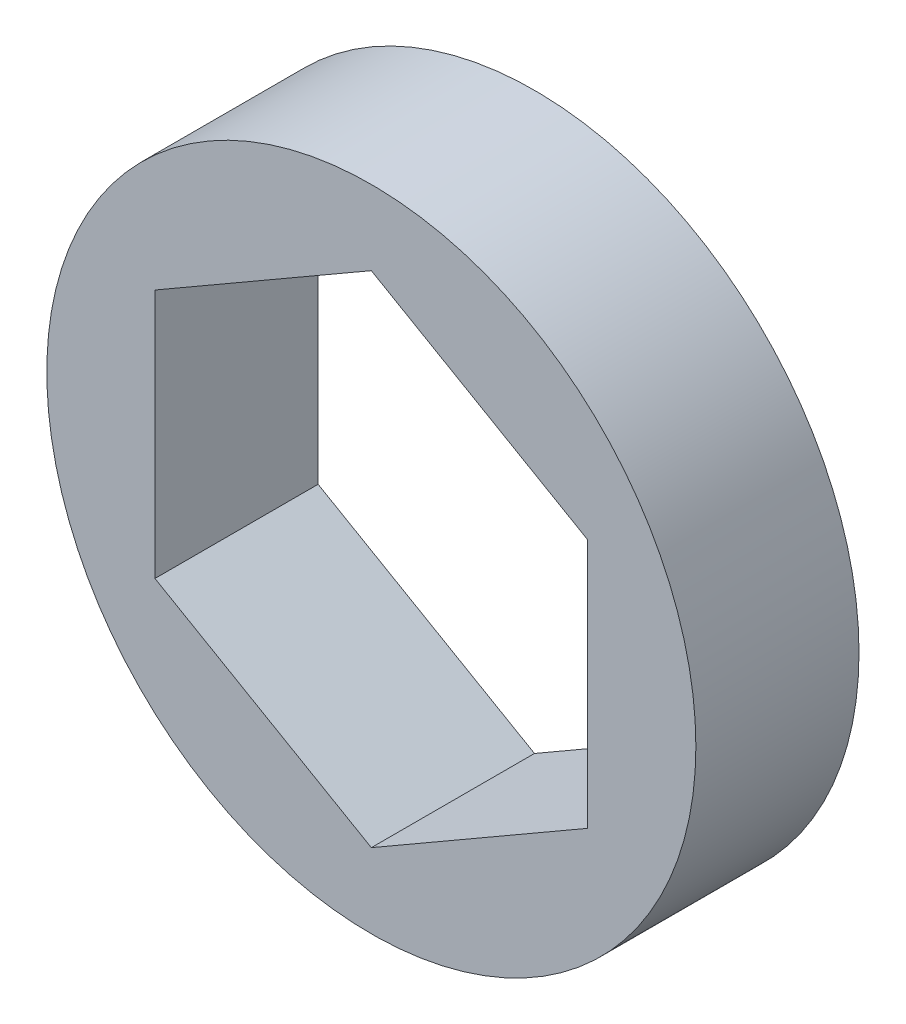
ISO-10303-21;
HEADER;
FILE_DESCRIPTION(('STEP AP214'),'2;1');
FILE_NAME('part.step','',(''),(''),'','','');
FILE_SCHEMA(('AUTOMOTIVE_DESIGN { 1 0 10303 214 1 1 1 1 }'));
ENDSEC;
DATA;
#1=APPLICATION_CONTEXT('core data for automotive mechanical design processes');
#2=APPLICATION_PROTOCOL_DEFINITION('international standard','automotive_design',2000,#1);
#3=PRODUCT_CONTEXT('',#1,'mechanical');
#4=PRODUCT('Part','Part','',(#3));
#5=PRODUCT_RELATED_PRODUCT_CATEGORY('part','',(#4));
#6=PRODUCT_DEFINITION_FORMATION('','',#4);
#7=PRODUCT_DEFINITION_CONTEXT('part definition',#1,'design');
#8=PRODUCT_DEFINITION('design','',#6,#7);
#9=PRODUCT_DEFINITION_SHAPE('','',#8);
#10=(LENGTH_UNIT() NAMED_UNIT(*) SI_UNIT(.MILLI.,.METRE.));
#11=(NAMED_UNIT(*) PLANE_ANGLE_UNIT() SI_UNIT($,.RADIAN.));
#12=(NAMED_UNIT(*) SI_UNIT($,.STERADIAN.) SOLID_ANGLE_UNIT());
#13=UNCERTAINTY_MEASURE_WITH_UNIT(LENGTH_MEASURE(1.E-05),#10,'distance_accuracy_value','');
#14=(GEOMETRIC_REPRESENTATION_CONTEXT(3) GLOBAL_UNCERTAINTY_ASSIGNED_CONTEXT((#13)) GLOBAL_UNIT_ASSIGNED_CONTEXT((#10,
#11,#12)) REPRESENTATION_CONTEXT('',''));
#15=CARTESIAN_POINT('',(0.,0.,0.));
#16=DIRECTION('',(0.,0.,1.));
#17=DIRECTION('',(1.,0.,0.));
#18=AXIS2_PLACEMENT_3D('',#15,#16,#17);
#19=CARTESIAN_POINT('',(0.,0.,4.7879));
#20=DIRECTION('',(0.,0.,1.));
#21=DIRECTION('',(1.,0.,0.));
#22=AXIS2_PLACEMENT_3D('',#19,#20,#21);
#23=PLANE('',#22);
#24=CARTESIAN_POINT('',(0.,0.,4.7879));
#25=DIRECTION('',(0.,0.,1.));
#26=DIRECTION('',(1.,0.,0.));
#27=AXIS2_PLACEMENT_3D('',#24,#25,#26);
#28=CIRCLE('',#27,9.525);
#29=CARTESIAN_POINT('',(9.525,0.,4.7879));
#30=VERTEX_POINT('',#29);
#31=EDGE_CURVE('E11',#30,#30,#28,.T.);
#32=ORIENTED_EDGE('',*,*,#31,.T.);
#33=EDGE_LOOP('',(#32));
#34=FACE_BOUND('',#33,.T.);
#35=DIRECTION('',(-0.866025403784438,-0.500000000000001,0.));
#36=VECTOR('',#35,1.);
#37=CARTESIAN_POINT('',(0.,7.33234841870825,4.7879));
#38=LINE('',#37,#36);
#39=CARTESIAN_POINT('',(0.,7.33234841870825,4.7879));
#40=VERTEX_POINT('',#39);
#41=CARTESIAN_POINT('',(-6.35000000000001,3.66617420935411,4.7879));
#42=VERTEX_POINT('',#41);
#43=EDGE_CURVE('E106',#40,#42,#38,.T.);
#44=ORIENTED_EDGE('',*,*,#43,.F.);
#45=DIRECTION('',(-0.866025403784441,0.499999999999995,0.));
#46=VECTOR('',#45,1.);
#47=CARTESIAN_POINT('',(6.34999999999996,3.6661742093542,4.7879));
#48=LINE('',#47,#46);
#49=CARTESIAN_POINT('',(6.34999999999996,3.6661742093542,4.7879));
#50=VERTEX_POINT('',#49);
#51=EDGE_CURVE('E97',#50,#40,#48,.T.);
#52=ORIENTED_EDGE('',*,*,#51,.F.);
#53=DIRECTION('',(0.,1.,0.));
#54=VECTOR('',#53,1.);
#55=CARTESIAN_POINT('',(6.35000000000003,-3.66617420935406,4.7879));
#56=LINE('',#55,#54);
#57=CARTESIAN_POINT('',(6.35000000000003,-3.66617420935406,4.7879));
#58=VERTEX_POINT('',#57);
#59=EDGE_CURVE('E131',#58,#50,#56,.T.);
#60=ORIENTED_EDGE('',*,*,#59,.F.);
#61=DIRECTION('',(0.866025403784434,0.500000000000007,0.));
#62=VECTOR('',#61,1.);
#63=CARTESIAN_POINT('',(0.,-7.33234841870825,4.7879));
#64=LINE('',#63,#62);
#65=CARTESIAN_POINT('',(0.,-7.33234841870825,4.7879));
#66=VERTEX_POINT('',#65);
#67=EDGE_CURVE('E128',#66,#58,#64,.T.);
#68=ORIENTED_EDGE('',*,*,#67,.F.);
#69=DIRECTION('',(0.866025403784442,-0.499999999999995,0.));
#70=VECTOR('',#69,1.);
#71=CARTESIAN_POINT('',(-6.34999999999998,-3.66617420935415,4.7879));
#72=LINE('',#71,#70);
#73=CARTESIAN_POINT('',(-6.34999999999998,-3.66617420935415,4.7879));
#74=VERTEX_POINT('',#73);
#75=EDGE_CURVE('E123',#74,#66,#72,.T.);
#76=ORIENTED_EDGE('',*,*,#75,.F.);
#77=DIRECTION('',(0.,-1.,0.));
#78=VECTOR('',#77,1.);
#79=CARTESIAN_POINT('',(-6.35000000000001,3.66617420935411,4.7879));
#80=LINE('',#79,#78);
#81=EDGE_CURVE('E119',#42,#74,#80,.T.);
#82=ORIENTED_EDGE('',*,*,#81,.F.);
#83=EDGE_LOOP('',(#44,#52,#60,#68,#76,#82));
#84=FACE_BOUND('',#83,.T.);
#85=ADVANCED_FACE('F43',(#34,#84),#23,.T.);
#86=CARTESIAN_POINT('',(0.,0.,0.));
#87=DIRECTION('',(0.,0.,1.));
#88=DIRECTION('',(1.,0.,0.));
#89=AXIS2_PLACEMENT_3D('',#86,#87,#88);
#90=PLANE('',#89);
#91=CARTESIAN_POINT('',(0.,0.,0.));
#92=DIRECTION('',(0.,0.,1.));
#93=DIRECTION('',(1.,0.,0.));
#94=AXIS2_PLACEMENT_3D('',#91,#92,#93);
#95=CIRCLE('',#94,9.525);
#96=CARTESIAN_POINT('',(9.525,0.,0.));
#97=VERTEX_POINT('',#96);
#98=EDGE_CURVE('E47',#97,#97,#95,.T.);
#99=ORIENTED_EDGE('',*,*,#98,.F.);
#100=EDGE_LOOP('',(#99));
#101=FACE_BOUND('',#100,.T.);
#102=DIRECTION('',(-0.866025403784441,0.499999999999995,0.));
#103=VECTOR('',#102,1.);
#104=CARTESIAN_POINT('',(6.34999999999996,3.6661742093542,0.));
#105=LINE('',#104,#103);
#106=CARTESIAN_POINT('',(6.34999999999996,3.6661742093542,0.));
#107=VERTEX_POINT('',#106);
#108=CARTESIAN_POINT('',(0.,7.33234841870825,0.));
#109=VERTEX_POINT('',#108);
#110=EDGE_CURVE('E67',#107,#109,#105,.T.);
#111=ORIENTED_EDGE('',*,*,#110,.T.);
#112=DIRECTION('',(-0.866025403784438,-0.500000000000001,0.));
#113=VECTOR('',#112,1.);
#114=CARTESIAN_POINT('',(0.,7.33234841870825,0.));
#115=LINE('',#114,#113);
#116=CARTESIAN_POINT('',(-6.35000000000001,3.66617420935411,0.));
#117=VERTEX_POINT('',#116);
#118=EDGE_CURVE('E113',#109,#117,#115,.T.);
#119=ORIENTED_EDGE('',*,*,#118,.T.);
#120=DIRECTION('',(0.,-1.,0.));
#121=VECTOR('',#120,1.);
#122=CARTESIAN_POINT('',(-6.35000000000001,3.66617420935411,0.));
#123=LINE('',#122,#121);
#124=CARTESIAN_POINT('',(-6.34999999999998,-3.66617420935415,0.));
#125=VERTEX_POINT('',#124);
#126=EDGE_CURVE('E138',#117,#125,#123,.T.);
#127=ORIENTED_EDGE('',*,*,#126,.T.);
#128=DIRECTION('',(0.866025403784442,-0.499999999999995,0.));
#129=VECTOR('',#128,1.);
#130=CARTESIAN_POINT('',(-6.34999999999998,-3.66617420935415,0.));
#131=LINE('',#130,#129);
#132=CARTESIAN_POINT('',(0.,-7.33234841870825,0.));
#133=VERTEX_POINT('',#132);
#134=EDGE_CURVE('E142',#125,#133,#131,.T.);
#135=ORIENTED_EDGE('',*,*,#134,.T.);
#136=DIRECTION('',(0.866025403784434,0.500000000000007,0.));
#137=VECTOR('',#136,1.);
#138=CARTESIAN_POINT('',(0.,-7.33234841870825,0.));
#139=LINE('',#138,#137);
#140=CARTESIAN_POINT('',(6.35000000000003,-3.66617420935406,0.));
#141=VERTEX_POINT('',#140);
#142=EDGE_CURVE('E146',#133,#141,#139,.T.);
#143=ORIENTED_EDGE('',*,*,#142,.T.);
#144=DIRECTION('',(0.,1.,0.));
#145=VECTOR('',#144,1.);
#146=CARTESIAN_POINT('',(6.35000000000003,-3.66617420935406,0.));
#147=LINE('',#146,#145);
#148=EDGE_CURVE('E107',#141,#107,#147,.T.);
#149=ORIENTED_EDGE('',*,*,#148,.T.);
#150=EDGE_LOOP('',(#111,#119,#127,#135,#143,#149));
#151=FACE_BOUND('',#150,.T.);
#152=ADVANCED_FACE('F170',(#101,#151),#90,.F.);
#153=CARTESIAN_POINT('',(0.,0.,4.7879));
#154=DIRECTION('',(0.,0.,-1.));
#155=DIRECTION('',(-1.,0.,0.));
#156=AXIS2_PLACEMENT_3D('',#153,#154,#155);
#157=CYLINDRICAL_SURFACE('',#156,9.525);
#158=ORIENTED_EDGE('',*,*,#31,.F.);
#159=EDGE_LOOP('',(#158));
#160=FACE_BOUND('',#159,.T.);
#161=ORIENTED_EDGE('',*,*,#98,.T.);
#162=EDGE_LOOP('',(#161));
#163=FACE_BOUND('',#162,.T.);
#164=ADVANCED_FACE('F45',(#160,#163),#157,.T.);
#165=CARTESIAN_POINT('',(6.34999999999996,3.6661742093542,4.7879));
#166=DIRECTION('',(-0.499999999999995,-0.866025403784441,0.));
#167=DIRECTION('',(0.866025403784442,-0.499999999999995,0.));
#168=AXIS2_PLACEMENT_3D('',#165,#166,#167);
#169=PLANE('',#168);
#170=ORIENTED_EDGE('',*,*,#110,.F.);
#171=DIRECTION('',(0.,0.,-1.));
#172=VECTOR('',#171,1.);
#173=CARTESIAN_POINT('',(6.34999999999996,3.6661742093542,4.7879));
#174=LINE('',#173,#172);
#175=EDGE_CURVE('E101',#50,#107,#174,.T.);
#176=ORIENTED_EDGE('',*,*,#175,.F.);
#177=ORIENTED_EDGE('',*,*,#51,.T.);
#178=DIRECTION('',(0.,0.,-1.));
#179=VECTOR('',#178,1.);
#180=CARTESIAN_POINT('',(0.,7.33234841870825,4.7879));
#181=LINE('',#180,#179);
#182=EDGE_CURVE('E100',#40,#109,#181,.T.);
#183=ORIENTED_EDGE('',*,*,#182,.T.);
#184=EDGE_LOOP('',(#170,#176,#177,#183));
#185=FACE_BOUND('',#184,.T.);
#186=ADVANCED_FACE('F99',(#185),#169,.T.);
#187=CARTESIAN_POINT('',(0.,7.33234841870825,4.7879));
#188=DIRECTION('',(0.500000000000001,-0.866025403784438,0.));
#189=DIRECTION('',(0.866025403784438,0.500000000000001,0.));
#190=AXIS2_PLACEMENT_3D('',#187,#188,#189);
#191=PLANE('',#190);
#192=ORIENTED_EDGE('',*,*,#118,.F.);
#193=ORIENTED_EDGE('',*,*,#182,.F.);
#194=ORIENTED_EDGE('',*,*,#43,.T.);
#195=DIRECTION('',(0.,0.,-1.));
#196=VECTOR('',#195,1.);
#197=CARTESIAN_POINT('',(-6.35000000000001,3.66617420935411,4.7879));
#198=LINE('',#197,#196);
#199=EDGE_CURVE('E115',#42,#117,#198,.T.);
#200=ORIENTED_EDGE('',*,*,#199,.T.);
#201=EDGE_LOOP('',(#192,#193,#194,#200));
#202=FACE_BOUND('',#201,.T.);
#203=ADVANCED_FACE('F110',(#202),#191,.T.);
#204=CARTESIAN_POINT('',(-6.35000000000001,3.66617420935411,4.7879));
#205=DIRECTION('',(1.,0.,0.));
#206=DIRECTION('',(0.,1.,0.));
#207=AXIS2_PLACEMENT_3D('',#204,#205,#206);
#208=PLANE('',#207);
#209=ORIENTED_EDGE('',*,*,#126,.F.);
#210=ORIENTED_EDGE('',*,*,#199,.F.);
#211=ORIENTED_EDGE('',*,*,#81,.T.);
#212=DIRECTION('',(0.,0.,-1.));
#213=VECTOR('',#212,1.);
#214=CARTESIAN_POINT('',(-6.34999999999998,-3.66617420935415,4.7879));
#215=LINE('',#214,#213);
#216=EDGE_CURVE('E160',#74,#125,#215,.T.);
#217=ORIENTED_EDGE('',*,*,#216,.T.);
#218=EDGE_LOOP('',(#209,#210,#211,#217));
#219=FACE_BOUND('',#218,.T.);
#220=ADVANCED_FACE('F166',(#219),#208,.T.);
#221=CARTESIAN_POINT('',(-6.34999999999998,-3.66617420935415,4.7879));
#222=DIRECTION('',(0.499999999999995,0.866025403784441,0.));
#223=DIRECTION('',(-0.866025403784442,0.499999999999995,0.));
#224=AXIS2_PLACEMENT_3D('',#221,#222,#223);
#225=PLANE('',#224);
#226=ORIENTED_EDGE('',*,*,#134,.F.);
#227=ORIENTED_EDGE('',*,*,#216,.F.);
#228=ORIENTED_EDGE('',*,*,#75,.T.);
#229=DIRECTION('',(0.,0.,-1.));
#230=VECTOR('',#229,1.);
#231=CARTESIAN_POINT('',(0.,-7.33234841870825,4.7879));
#232=LINE('',#231,#230);
#233=EDGE_CURVE('E157',#66,#133,#232,.T.);
#234=ORIENTED_EDGE('',*,*,#233,.T.);
#235=EDGE_LOOP('',(#226,#227,#228,#234));
#236=FACE_BOUND('',#235,.T.);
#237=ADVANCED_FACE('F178',(#236),#225,.T.);
#238=CARTESIAN_POINT('',(0.,-7.33234841870825,4.7879));
#239=DIRECTION('',(-0.500000000000007,0.866025403784435,0.));
#240=DIRECTION('',(-0.866025403784435,-0.500000000000007,0.));
#241=AXIS2_PLACEMENT_3D('',#238,#239,#240);
#242=PLANE('',#241);
#243=ORIENTED_EDGE('',*,*,#142,.F.);
#244=ORIENTED_EDGE('',*,*,#233,.F.);
#245=ORIENTED_EDGE('',*,*,#67,.T.);
#246=DIRECTION('',(0.,0.,-1.));
#247=VECTOR('',#246,1.);
#248=CARTESIAN_POINT('',(6.35000000000003,-3.66617420935406,4.7879));
#249=LINE('',#248,#247);
#250=EDGE_CURVE('E59',#58,#141,#249,.T.);
#251=ORIENTED_EDGE('',*,*,#250,.T.);
#252=EDGE_LOOP('',(#243,#244,#245,#251));
#253=FACE_BOUND('',#252,.T.);
#254=ADVANCED_FACE('F176',(#253),#242,.T.);
#255=CARTESIAN_POINT('',(6.35000000000003,-3.66617420935406,4.7879));
#256=DIRECTION('',(-1.,0.,0.));
#257=DIRECTION('',(0.,-1.,0.));
#258=AXIS2_PLACEMENT_3D('',#255,#256,#257);
#259=PLANE('',#258);
#260=ORIENTED_EDGE('',*,*,#148,.F.);
#261=ORIENTED_EDGE('',*,*,#250,.F.);
#262=ORIENTED_EDGE('',*,*,#59,.T.);
#263=ORIENTED_EDGE('',*,*,#175,.T.);
#264=EDGE_LOOP('',(#260,#261,#262,#263));
#265=FACE_BOUND('',#264,.T.);
#266=ADVANCED_FACE('F172',(#265),#259,.T.);
#267=CLOSED_SHELL('',(#85,#152,#164,#186,#203,#220,#237,#254,#266));
#268=MANIFOLD_SOLID_BREP('B2',#267);
#269=ADVANCED_BREP_SHAPE_REPRESENTATION('',(#18,#268),#14);
#270=SHAPE_DEFINITION_REPRESENTATION(#9,#269);
ENDSEC;
END-ISO-10303-21;
